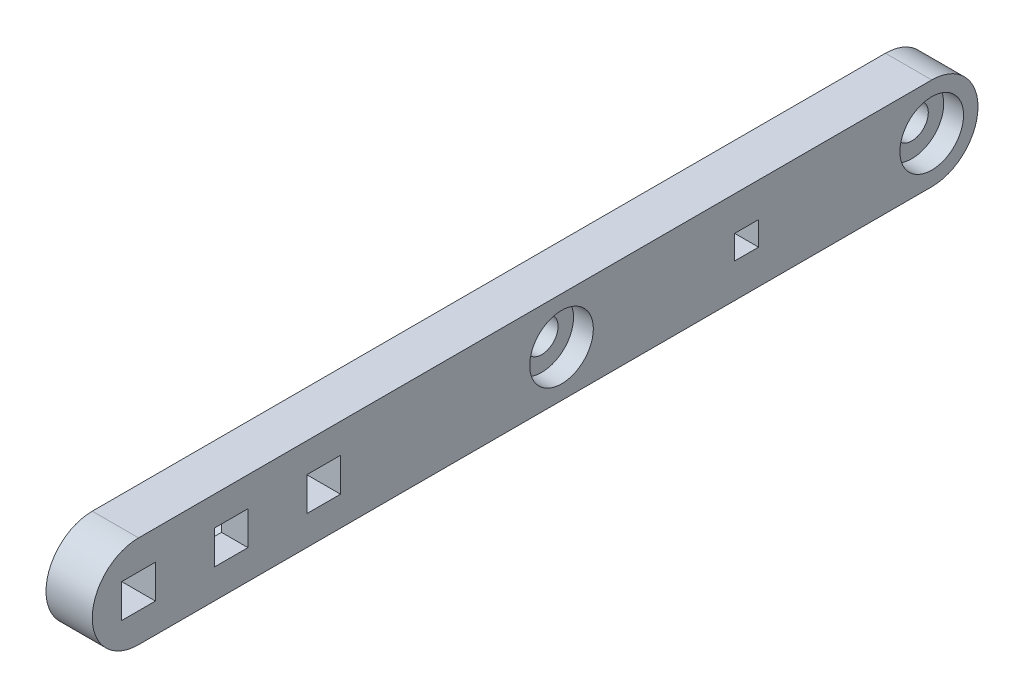
ISO-10303-21;
HEADER;
FILE_DESCRIPTION(('STEP AP214'),'2;1');
FILE_NAME('part.step','',(''),(''),'','','');
FILE_SCHEMA(('AUTOMOTIVE_DESIGN { 1 0 10303 214 1 1 1 1 }'));
ENDSEC;
DATA;
#1=APPLICATION_CONTEXT('core data for automotive mechanical design processes');
#2=APPLICATION_PROTOCOL_DEFINITION('international standard','automotive_design',2000,#1);
#3=PRODUCT_CONTEXT('',#1,'mechanical');
#4=PRODUCT('Part','Part','',(#3));
#5=PRODUCT_RELATED_PRODUCT_CATEGORY('part','',(#4));
#6=PRODUCT_DEFINITION_FORMATION('','',#4);
#7=PRODUCT_DEFINITION_CONTEXT('part definition',#1,'design');
#8=PRODUCT_DEFINITION('design','',#6,#7);
#9=PRODUCT_DEFINITION_SHAPE('','',#8);
#10=(LENGTH_UNIT() NAMED_UNIT(*) SI_UNIT(.MILLI.,.METRE.));
#11=(NAMED_UNIT(*) PLANE_ANGLE_UNIT() SI_UNIT($,.RADIAN.));
#12=(NAMED_UNIT(*) SI_UNIT($,.STERADIAN.) SOLID_ANGLE_UNIT());
#13=UNCERTAINTY_MEASURE_WITH_UNIT(LENGTH_MEASURE(1.E-05),#10,'distance_accuracy_value','');
#14=(GEOMETRIC_REPRESENTATION_CONTEXT(3) GLOBAL_UNCERTAINTY_ASSIGNED_CONTEXT((#13)) GLOBAL_UNIT_ASSIGNED_CONTEXT((#10,
#11,#12)) REPRESENTATION_CONTEXT('',''));
#15=CARTESIAN_POINT('',(0.,0.,0.));
#16=DIRECTION('',(0.,0.,1.));
#17=DIRECTION('',(1.,0.,0.));
#18=AXIS2_PLACEMENT_3D('',#15,#16,#17);
#19=CARTESIAN_POINT('',(0.,0.,0.));
#20=DIRECTION('',(1.,0.,0.));
#21=DIRECTION('',(0.,0.,-1.));
#22=AXIS2_PLACEMENT_3D('',#19,#20,#21);
#23=PLANE('',#22);
#24=DIRECTION('',(0.,-1.,0.));
#25=VECTOR('',#24,1.);
#26=CARTESIAN_POINT('',(0.,0.,-1.6375));
#27=LINE('',#26,#25);
#28=CARTESIAN_POINT('',(0.,1.6375,-1.6375));
#29=VERTEX_POINT('',#28);
#30=CARTESIAN_POINT('',(0.,-1.6375,-1.6375));
#31=VERTEX_POINT('',#30);
#32=EDGE_CURVE('E391',#29,#31,#27,.T.);
#33=ORIENTED_EDGE('',*,*,#32,.F.);
#34=DIRECTION('',(0.,0.,-1.));
#35=VECTOR('',#34,1.);
#36=CARTESIAN_POINT('',(0.,1.6375,0.));
#37=LINE('',#36,#35);
#38=CARTESIAN_POINT('',(0.,1.6375,1.6375));
#39=VERTEX_POINT('',#38);
#40=EDGE_CURVE('E400',#39,#29,#37,.T.);
#41=ORIENTED_EDGE('',*,*,#40,.F.);
#42=DIRECTION('',(0.,-1.,0.));
#43=VECTOR('',#42,1.);
#44=CARTESIAN_POINT('',(0.,0.,1.6375));
#45=LINE('',#44,#43);
#46=CARTESIAN_POINT('',(0.,-1.6375,1.6375));
#47=VERTEX_POINT('',#46);
#48=EDGE_CURVE('E397',#39,#47,#45,.T.);
#49=ORIENTED_EDGE('',*,*,#48,.T.);
#50=DIRECTION('',(0.,0.,-1.));
#51=VECTOR('',#50,1.);
#52=CARTESIAN_POINT('',(0.,-1.6375,0.));
#53=LINE('',#52,#51);
#54=EDGE_CURVE('E394',#47,#31,#53,.T.);
#55=ORIENTED_EDGE('',*,*,#54,.T.);
#56=EDGE_LOOP('',(#33,#41,#49,#55));
#57=FACE_BOUND('',#56,.T.);
#58=DIRECTION('',(0.,-1.,0.));
#59=VECTOR('',#58,1.);
#60=CARTESIAN_POINT('',(0.,0.,60.3504));
#61=LINE('',#60,#59);
#62=CARTESIAN_POINT('',(0.,2.3114,60.3504));
#63=VERTEX_POINT('',#62);
#64=CARTESIAN_POINT('',(0.,-2.31139999999999,60.3504));
#65=VERTEX_POINT('',#64);
#66=EDGE_CURVE('E402',#63,#65,#61,.T.);
#67=ORIENTED_EDGE('',*,*,#66,.T.);
#68=DIRECTION('',(0.,0.,-1.));
#69=VECTOR('',#68,1.);
#70=CARTESIAN_POINT('',(0.,-2.31139999999999,0.));
#71=LINE('',#70,#69);
#72=CARTESIAN_POINT('',(0.,-2.31139999999999,55.7276));
#73=VERTEX_POINT('',#72);
#74=EDGE_CURVE('E334',#65,#73,#71,.T.);
#75=ORIENTED_EDGE('',*,*,#74,.T.);
#76=DIRECTION('',(0.,-1.,0.));
#77=VECTOR('',#76,1.);
#78=CARTESIAN_POINT('',(0.,0.,55.7276));
#79=LINE('',#78,#77);
#80=CARTESIAN_POINT('',(0.,2.3114,55.7276));
#81=VERTEX_POINT('',#80);
#82=EDGE_CURVE('E407',#81,#73,#79,.T.);
#83=ORIENTED_EDGE('',*,*,#82,.F.);
#84=DIRECTION('',(0.,0.,-1.));
#85=VECTOR('',#84,1.);
#86=CARTESIAN_POINT('',(0.,2.3114,0.));
#87=LINE('',#86,#85);
#88=EDGE_CURVE('E404',#63,#81,#87,.T.);
#89=ORIENTED_EDGE('',*,*,#88,.F.);
#90=EDGE_LOOP('',(#67,#75,#83,#89));
#91=FACE_BOUND('',#90,.T.);
#92=DIRECTION('',(0.,0.,-1.));
#93=VECTOR('',#92,1.);
#94=CARTESIAN_POINT('',(0.,-2.31139999999999,0.));
#95=LINE('',#94,#93);
#96=CARTESIAN_POINT('',(0.,-2.31139999999999,85.7504));
#97=VERTEX_POINT('',#96);
#98=CARTESIAN_POINT('',(0.,-2.31139999999999,81.1276));
#99=VERTEX_POINT('',#98);
#100=EDGE_CURVE('E379',#97,#99,#95,.T.);
#101=ORIENTED_EDGE('',*,*,#100,.T.);
#102=DIRECTION('',(0.,-1.,0.));
#103=VECTOR('',#102,1.);
#104=CARTESIAN_POINT('',(0.,0.,81.1276));
#105=LINE('',#104,#103);
#106=CARTESIAN_POINT('',(0.,2.3114,81.1276));
#107=VERTEX_POINT('',#106);
#108=EDGE_CURVE('E388',#107,#99,#105,.T.);
#109=ORIENTED_EDGE('',*,*,#108,.F.);
#110=DIRECTION('',(0.,0.,-1.));
#111=VECTOR('',#110,1.);
#112=CARTESIAN_POINT('',(0.,2.3114,0.));
#113=LINE('',#112,#111);
#114=CARTESIAN_POINT('',(0.,2.3114,85.7504));
#115=VERTEX_POINT('',#114);
#116=EDGE_CURVE('E385',#115,#107,#113,.T.);
#117=ORIENTED_EDGE('',*,*,#116,.F.);
#118=DIRECTION('',(0.,-1.,0.));
#119=VECTOR('',#118,1.);
#120=CARTESIAN_POINT('',(0.,0.,85.7504));
#121=LINE('',#120,#119);
#122=EDGE_CURVE('E382',#115,#97,#121,.T.);
#123=ORIENTED_EDGE('',*,*,#122,.T.);
#124=EDGE_LOOP('',(#101,#109,#117,#123));
#125=FACE_BOUND('',#124,.T.);
#126=CARTESIAN_POINT('',(0.,0.,83.439));
#127=DIRECTION('',(1.,0.,0.));
#128=DIRECTION('',(0.,0.,-1.));
#129=AXIS2_PLACEMENT_3D('',#126,#127,#128);
#130=CIRCLE('',#129,6.35);
#131=CARTESIAN_POINT('',(0.,6.35000000000002,83.439));
#132=VERTEX_POINT('',#131);
#133=CARTESIAN_POINT('',(0.,-6.35000000000001,83.439));
#134=VERTEX_POINT('',#133);
#135=EDGE_CURVE('E312',#132,#134,#130,.T.);
#136=ORIENTED_EDGE('',*,*,#135,.F.);
#137=DIRECTION('',(0.,0.,-1.));
#138=VECTOR('',#137,1.);
#139=CARTESIAN_POINT('',(0.,6.35,0.));
#140=LINE('',#139,#138);
#141=CARTESIAN_POINT('',(0.,6.35000000000001,-25.4));
#142=VERTEX_POINT('',#141);
#143=EDGE_CURVE('E377',#132,#142,#140,.T.);
#144=ORIENTED_EDGE('',*,*,#143,.T.);
#145=CARTESIAN_POINT('',(0.,0.,-25.4));
#146=DIRECTION('',(1.,0.,0.));
#147=DIRECTION('',(0.,0.,-1.));
#148=AXIS2_PLACEMENT_3D('',#145,#146,#147);
#149=CIRCLE('',#148,6.35);
#150=CARTESIAN_POINT('',(0.,-6.35000000000001,-25.4));
#151=VERTEX_POINT('',#150);
#152=EDGE_CURVE('E313',#151,#142,#149,.T.);
#153=ORIENTED_EDGE('',*,*,#152,.F.);
#154=DIRECTION('',(0.,0.,-1.));
#155=VECTOR('',#154,1.);
#156=CARTESIAN_POINT('',(0.,-6.35,0.));
#157=LINE('',#156,#155);
#158=EDGE_CURVE('E374',#134,#151,#157,.T.);
#159=ORIENTED_EDGE('',*,*,#158,.F.);
#160=EDGE_LOOP('',(#136,#144,#153,#159));
#161=FACE_BOUND('',#160,.T.);
#162=CARTESIAN_POINT('',(0.,0.,-25.4));
#163=DIRECTION('',(1.,0.,0.));
#164=DIRECTION('',(0.,0.,-1.));
#165=AXIS2_PLACEMENT_3D('',#162,#163,#164);
#166=CIRCLE('',#165,2.2479);
#167=CARTESIAN_POINT('',(0.,0.,-27.6479));
#168=VERTEX_POINT('',#167);
#169=EDGE_CURVE('E316',#168,#168,#166,.T.);
#170=ORIENTED_EDGE('',*,*,#169,.T.);
#171=EDGE_LOOP('',(#170));
#172=FACE_BOUND('',#171,.T.);
#173=CARTESIAN_POINT('',(0.,0.,25.4));
#174=DIRECTION('',(1.,0.,0.));
#175=DIRECTION('',(0.,0.,-1.));
#176=AXIS2_PLACEMENT_3D('',#173,#174,#175);
#177=CIRCLE('',#176,2.2479);
#178=CARTESIAN_POINT('',(0.,0.,23.1521));
#179=VERTEX_POINT('',#178);
#180=EDGE_CURVE('E436',#179,#179,#177,.T.);
#181=ORIENTED_EDGE('',*,*,#180,.T.);
#182=EDGE_LOOP('',(#181));
#183=FACE_BOUND('',#182,.T.);
#184=CARTESIAN_POINT('',(0.,0.,70.739));
#185=DIRECTION('',(-1.,0.,0.));
#186=DIRECTION('',(0.,0.,1.));
#187=AXIS2_PLACEMENT_3D('',#184,#185,#186);
#188=CIRCLE('',#187,4.36626);
#189=CARTESIAN_POINT('',(0.,0.,75.10526));
#190=VERTEX_POINT('',#189);
#191=EDGE_CURVE('E427',#190,#190,#188,.T.);
#192=ORIENTED_EDGE('',*,*,#191,.F.);
#193=EDGE_LOOP('',(#192));
#194=FACE_BOUND('',#193,.T.);
#195=ADVANCED_FACE('F104',(#57,#91,#125,#161,#172,#183,#194),#23,.F.);
#196=CARTESIAN_POINT('',(6.35,0.,85.7504));
#197=DIRECTION('',(0.,0.,-1.));
#198=DIRECTION('',(-1.,0.,0.));
#199=AXIS2_PLACEMENT_3D('',#196,#197,#198);
#200=PLANE('',#199);
#201=ORIENTED_EDGE('',*,*,#122,.F.);
#202=DIRECTION('',(-1.,0.,0.));
#203=VECTOR('',#202,1.);
#204=CARTESIAN_POINT('',(6.35,2.3114,85.7504));
#205=LINE('',#204,#203);
#206=CARTESIAN_POINT('',(6.35,2.3114,85.7504));
#207=VERTEX_POINT('',#206);
#208=EDGE_CURVE('E299',#207,#115,#205,.T.);
#209=ORIENTED_EDGE('',*,*,#208,.F.);
#210=DIRECTION('',(0.,-1.,0.));
#211=VECTOR('',#210,1.);
#212=CARTESIAN_POINT('',(6.35,0.,85.7504));
#213=LINE('',#212,#211);
#214=CARTESIAN_POINT('',(6.35,-2.31139999999999,85.7504));
#215=VERTEX_POINT('',#214);
#216=EDGE_CURVE('E343',#207,#215,#213,.T.);
#217=ORIENTED_EDGE('',*,*,#216,.T.);
#218=DIRECTION('',(-1.,0.,0.));
#219=VECTOR('',#218,1.);
#220=CARTESIAN_POINT('',(6.35,-2.31139999999999,85.7504));
#221=LINE('',#220,#219);
#222=EDGE_CURVE('E289',#215,#97,#221,.T.);
#223=ORIENTED_EDGE('',*,*,#222,.T.);
#224=EDGE_LOOP('',(#201,#209,#217,#223));
#225=FACE_BOUND('',#224,.T.);
#226=ADVANCED_FACE('F468',(#225),#200,.T.);
#227=CARTESIAN_POINT('',(6.35,2.3114,0.));
#228=DIRECTION('',(0.,1.,0.));
#229=DIRECTION('',(0.,0.,1.));
#230=AXIS2_PLACEMENT_3D('',#227,#228,#229);
#231=PLANE('',#230);
#232=ORIENTED_EDGE('',*,*,#116,.T.);
#233=DIRECTION('',(-1.,0.,0.));
#234=VECTOR('',#233,1.);
#235=CARTESIAN_POINT('',(6.35,2.3114,81.1276));
#236=LINE('',#235,#234);
#237=CARTESIAN_POINT('',(6.35,2.3114,81.1276));
#238=VERTEX_POINT('',#237);
#239=EDGE_CURVE('E296',#238,#107,#236,.T.);
#240=ORIENTED_EDGE('',*,*,#239,.F.);
#241=DIRECTION('',(0.,0.,-1.));
#242=VECTOR('',#241,1.);
#243=CARTESIAN_POINT('',(6.35,2.3114,0.));
#244=LINE('',#243,#242);
#245=EDGE_CURVE('E346',#207,#238,#244,.T.);
#246=ORIENTED_EDGE('',*,*,#245,.F.);
#247=ORIENTED_EDGE('',*,*,#208,.T.);
#248=EDGE_LOOP('',(#232,#240,#246,#247));
#249=FACE_BOUND('',#248,.T.);
#250=ADVANCED_FACE('F474',(#249),#231,.F.);
#251=CARTESIAN_POINT('',(6.35,0.,81.1276));
#252=DIRECTION('',(0.,0.,-1.));
#253=DIRECTION('',(-1.,0.,0.));
#254=AXIS2_PLACEMENT_3D('',#251,#252,#253);
#255=PLANE('',#254);
#256=ORIENTED_EDGE('',*,*,#108,.T.);
#257=DIRECTION('',(-1.,0.,0.));
#258=VECTOR('',#257,1.);
#259=CARTESIAN_POINT('',(6.35,-2.31139999999999,81.1276));
#260=LINE('',#259,#258);
#261=CARTESIAN_POINT('',(6.35,-2.31139999999999,81.1276));
#262=VERTEX_POINT('',#261);
#263=EDGE_CURVE('E294',#262,#99,#260,.T.);
#264=ORIENTED_EDGE('',*,*,#263,.F.);
#265=DIRECTION('',(0.,-1.,0.));
#266=VECTOR('',#265,1.);
#267=CARTESIAN_POINT('',(6.35,0.,81.1276));
#268=LINE('',#267,#266);
#269=EDGE_CURVE('E349',#238,#262,#268,.T.);
#270=ORIENTED_EDGE('',*,*,#269,.F.);
#271=ORIENTED_EDGE('',*,*,#239,.T.);
#272=EDGE_LOOP('',(#256,#264,#270,#271));
#273=FACE_BOUND('',#272,.T.);
#274=ADVANCED_FACE('F476',(#273),#255,.F.);
#275=CARTESIAN_POINT('',(6.35,-2.31139999999999,0.));
#276=DIRECTION('',(0.,1.,0.));
#277=DIRECTION('',(0.,0.,1.));
#278=AXIS2_PLACEMENT_3D('',#275,#276,#277);
#279=PLANE('',#278);
#280=ORIENTED_EDGE('',*,*,#100,.F.);
#281=ORIENTED_EDGE('',*,*,#222,.F.);
#282=DIRECTION('',(0.,0.,-1.));
#283=VECTOR('',#282,1.);
#284=CARTESIAN_POINT('',(6.35,-2.31139999999999,0.));
#285=LINE('',#284,#283);
#286=EDGE_CURVE('E340',#215,#262,#285,.T.);
#287=ORIENTED_EDGE('',*,*,#286,.T.);
#288=ORIENTED_EDGE('',*,*,#263,.T.);
#289=EDGE_LOOP('',(#280,#281,#287,#288));
#290=FACE_BOUND('',#289,.T.);
#291=ADVANCED_FACE('F477',(#290),#279,.T.);
#292=CARTESIAN_POINT('',(6.35,0.,83.439));
#293=DIRECTION('',(-1.,0.,0.));
#294=DIRECTION('',(0.,0.,1.));
#295=AXIS2_PLACEMENT_3D('',#292,#293,#294);
#296=CYLINDRICAL_SURFACE('',#295,6.35);
#297=ORIENTED_EDGE('',*,*,#135,.T.);
#298=DIRECTION('',(-1.,0.,0.));
#299=VECTOR('',#298,1.);
#300=CARTESIAN_POINT('',(6.35,-6.35000000000001,83.439));
#301=LINE('',#300,#299);
#302=CARTESIAN_POINT('',(6.35,-6.35000000000001,83.439));
#303=VERTEX_POINT('',#302);
#304=EDGE_CURVE('E193',#303,#134,#301,.T.);
#305=ORIENTED_EDGE('',*,*,#304,.F.);
#306=CARTESIAN_POINT('',(6.35,0.,83.439));
#307=DIRECTION('',(1.,0.,0.));
#308=DIRECTION('',(0.,0.,-1.));
#309=AXIS2_PLACEMENT_3D('',#306,#307,#308);
#310=CIRCLE('',#309,6.35);
#311=CARTESIAN_POINT('',(6.35,6.35000000000002,83.439));
#312=VERTEX_POINT('',#311);
#313=EDGE_CURVE('E330',#312,#303,#310,.T.);
#314=ORIENTED_EDGE('',*,*,#313,.F.);
#315=DIRECTION('',(-1.,0.,0.));
#316=VECTOR('',#315,1.);
#317=CARTESIAN_POINT('',(6.35,6.35000000000002,83.439));
#318=LINE('',#317,#316);
#319=EDGE_CURVE('E302',#312,#132,#318,.T.);
#320=ORIENTED_EDGE('',*,*,#319,.T.);
#321=EDGE_LOOP('',(#297,#305,#314,#320));
#322=FACE_BOUND('',#321,.T.);
#323=ADVANCED_FACE('F456',(#322),#296,.T.);
#324=CARTESIAN_POINT('',(6.35,0.,0.));
#325=DIRECTION('',(1.,0.,0.));
#326=DIRECTION('',(0.,0.,-1.));
#327=AXIS2_PLACEMENT_3D('',#324,#325,#326);
#328=PLANE('',#327);
#329=CARTESIAN_POINT('',(6.35,0.,25.4));
#330=DIRECTION('',(1.,0.,0.));
#331=DIRECTION('',(0.,0.,-1.));
#332=AXIS2_PLACEMENT_3D('',#329,#330,#331);
#333=CIRCLE('',#332,4.36626);
#334=CARTESIAN_POINT('',(6.35,0.,21.03374));
#335=VERTEX_POINT('',#334);
#336=EDGE_CURVE('E420',#335,#335,#333,.T.);
#337=ORIENTED_EDGE('',*,*,#336,.F.);
#338=EDGE_LOOP('',(#337));
#339=FACE_BOUND('',#338,.T.);
#340=CARTESIAN_POINT('',(6.35,0.,-25.4));
#341=DIRECTION('',(1.,0.,0.));
#342=DIRECTION('',(0.,0.,-1.));
#343=AXIS2_PLACEMENT_3D('',#340,#341,#342);
#344=CIRCLE('',#343,4.36626);
#345=CARTESIAN_POINT('',(6.35,0.,-29.76626));
#346=VERTEX_POINT('',#345);
#347=EDGE_CURVE('E439',#346,#346,#344,.T.);
#348=ORIENTED_EDGE('',*,*,#347,.F.);
#349=EDGE_LOOP('',(#348));
#350=FACE_BOUND('',#349,.T.);
#351=ORIENTED_EDGE('',*,*,#313,.T.);
#352=DIRECTION('',(0.,0.,-1.));
#353=VECTOR('',#352,1.);
#354=CARTESIAN_POINT('',(6.35,-6.35,0.));
#355=LINE('',#354,#353);
#356=CARTESIAN_POINT('',(6.35,-6.35000000000001,-25.4));
#357=VERTEX_POINT('',#356);
#358=EDGE_CURVE('E333',#303,#357,#355,.T.);
#359=ORIENTED_EDGE('',*,*,#358,.T.);
#360=CARTESIAN_POINT('',(6.35,0.,-25.4));
#361=DIRECTION('',(1.,0.,0.));
#362=DIRECTION('',(0.,0.,-1.));
#363=AXIS2_PLACEMENT_3D('',#360,#361,#362);
#364=CIRCLE('',#363,6.35);
#365=CARTESIAN_POINT('',(6.35,6.35000000000001,-25.4));
#366=VERTEX_POINT('',#365);
#367=EDGE_CURVE('E309',#357,#366,#364,.T.);
#368=ORIENTED_EDGE('',*,*,#367,.T.);
#369=DIRECTION('',(0.,0.,-1.));
#370=VECTOR('',#369,1.);
#371=CARTESIAN_POINT('',(6.35,6.35,0.));
#372=LINE('',#371,#370);
#373=EDGE_CURVE('E337',#312,#366,#372,.T.);
#374=ORIENTED_EDGE('',*,*,#373,.F.);
#375=EDGE_LOOP('',(#351,#359,#368,#374));
#376=FACE_BOUND('',#375,.T.);
#377=ORIENTED_EDGE('',*,*,#286,.F.);
#378=ORIENTED_EDGE('',*,*,#216,.F.);
#379=ORIENTED_EDGE('',*,*,#245,.T.);
#380=ORIENTED_EDGE('',*,*,#269,.T.);
#381=EDGE_LOOP('',(#377,#378,#379,#380));
#382=FACE_BOUND('',#381,.T.);
#383=DIRECTION('',(0.,-1.,0.));
#384=VECTOR('',#383,1.);
#385=CARTESIAN_POINT('',(6.35,0.,73.0504));
#386=LINE('',#385,#384);
#387=CARTESIAN_POINT('',(6.35,2.3114,73.0504));
#388=VERTEX_POINT('',#387);
#389=CARTESIAN_POINT('',(6.35,-2.31139999999999,73.0504));
#390=VERTEX_POINT('',#389);
#391=EDGE_CURVE('E264',#388,#390,#386,.T.);
#392=ORIENTED_EDGE('',*,*,#391,.F.);
#393=DIRECTION('',(0.,0.,-1.));
#394=VECTOR('',#393,1.);
#395=CARTESIAN_POINT('',(6.35,2.3114,0.));
#396=LINE('',#395,#394);
#397=CARTESIAN_POINT('',(6.35,2.3114,68.4276));
#398=VERTEX_POINT('',#397);
#399=EDGE_CURVE('E258',#388,#398,#396,.T.);
#400=ORIENTED_EDGE('',*,*,#399,.T.);
#401=DIRECTION('',(0.,-1.,0.));
#402=VECTOR('',#401,1.);
#403=CARTESIAN_POINT('',(6.35,0.,68.4276));
#404=LINE('',#403,#402);
#405=CARTESIAN_POINT('',(6.35,-2.31139999999999,68.4276));
#406=VERTEX_POINT('',#405);
#407=EDGE_CURVE('E247',#398,#406,#404,.T.);
#408=ORIENTED_EDGE('',*,*,#407,.T.);
#409=DIRECTION('',(0.,0.,-1.));
#410=VECTOR('',#409,1.);
#411=CARTESIAN_POINT('',(6.35,-2.31139999999999,0.));
#412=LINE('',#411,#410);
#413=EDGE_CURVE('E257',#390,#406,#412,.T.);
#414=ORIENTED_EDGE('',*,*,#413,.F.);
#415=EDGE_LOOP('',(#392,#400,#408,#414));
#416=FACE_BOUND('',#415,.T.);
#417=DIRECTION('',(0.,-1.,0.));
#418=VECTOR('',#417,1.);
#419=CARTESIAN_POINT('',(6.35,0.,60.3504));
#420=LINE('',#419,#418);
#421=CARTESIAN_POINT('',(6.35,2.3114,60.3504));
#422=VERTEX_POINT('',#421);
#423=CARTESIAN_POINT('',(6.35,-2.31139999999999,60.3504));
#424=VERTEX_POINT('',#423);
#425=EDGE_CURVE('E361',#422,#424,#420,.T.);
#426=ORIENTED_EDGE('',*,*,#425,.F.);
#427=DIRECTION('',(0.,0.,-1.));
#428=VECTOR('',#427,1.);
#429=CARTESIAN_POINT('',(6.35,2.3114,0.));
#430=LINE('',#429,#428);
#431=CARTESIAN_POINT('',(6.35,2.3114,55.7276));
#432=VERTEX_POINT('',#431);
#433=EDGE_CURVE('E363',#422,#432,#430,.T.);
#434=ORIENTED_EDGE('',*,*,#433,.T.);
#435=DIRECTION('',(0.,-1.,0.));
#436=VECTOR('',#435,1.);
#437=CARTESIAN_POINT('',(6.35,0.,55.7276));
#438=LINE('',#437,#436);
#439=CARTESIAN_POINT('',(6.35,-2.31139999999999,55.7276));
#440=VERTEX_POINT('',#439);
#441=EDGE_CURVE('E366',#432,#440,#438,.T.);
#442=ORIENTED_EDGE('',*,*,#441,.T.);
#443=DIRECTION('',(0.,0.,-1.));
#444=VECTOR('',#443,1.);
#445=CARTESIAN_POINT('',(6.35,-2.31139999999999,0.));
#446=LINE('',#445,#444);
#447=EDGE_CURVE('E368',#424,#440,#446,.T.);
#448=ORIENTED_EDGE('',*,*,#447,.F.);
#449=EDGE_LOOP('',(#426,#434,#442,#448));
#450=FACE_BOUND('',#449,.T.);
#451=DIRECTION('',(0.,-1.,0.));
#452=VECTOR('',#451,1.);
#453=CARTESIAN_POINT('',(6.35,0.,-1.6375));
#454=LINE('',#453,#452);
#455=CARTESIAN_POINT('',(6.35,1.6375,-1.6375));
#456=VERTEX_POINT('',#455);
#457=CARTESIAN_POINT('',(6.35,-1.6375,-1.6375));
#458=VERTEX_POINT('',#457);
#459=EDGE_CURVE('E351',#456,#458,#454,.T.);
#460=ORIENTED_EDGE('',*,*,#459,.T.);
#461=DIRECTION('',(0.,0.,-1.));
#462=VECTOR('',#461,1.);
#463=CARTESIAN_POINT('',(6.35,-1.6375,0.));
#464=LINE('',#463,#462);
#465=CARTESIAN_POINT('',(6.35,-1.6375,1.6375));
#466=VERTEX_POINT('',#465);
#467=EDGE_CURVE('E353',#466,#458,#464,.T.);
#468=ORIENTED_EDGE('',*,*,#467,.F.);
#469=DIRECTION('',(0.,-1.,0.));
#470=VECTOR('',#469,1.);
#471=CARTESIAN_POINT('',(6.35,0.,1.6375));
#472=LINE('',#471,#470);
#473=CARTESIAN_POINT('',(6.35,1.6375,1.6375));
#474=VERTEX_POINT('',#473);
#475=EDGE_CURVE('E356',#474,#466,#472,.T.);
#476=ORIENTED_EDGE('',*,*,#475,.F.);
#477=DIRECTION('',(0.,0.,-1.));
#478=VECTOR('',#477,1.);
#479=CARTESIAN_POINT('',(6.35,1.6375,0.));
#480=LINE('',#479,#478);
#481=EDGE_CURVE('E359',#474,#456,#480,.T.);
#482=ORIENTED_EDGE('',*,*,#481,.T.);
#483=EDGE_LOOP('',(#460,#468,#476,#482));
#484=FACE_BOUND('',#483,.T.);
#485=ADVANCED_FACE('F262',(#339,#350,#376,#382,#416,#450,#484),#328,.T.);
#486=CARTESIAN_POINT('',(6.35,-6.35,0.));
#487=DIRECTION('',(0.,1.,0.));
#488=DIRECTION('',(0.,0.,1.));
#489=AXIS2_PLACEMENT_3D('',#486,#487,#488);
#490=PLANE('',#489);
#491=ORIENTED_EDGE('',*,*,#158,.T.);
#492=DIRECTION('',(-1.,0.,0.));
#493=VECTOR('',#492,1.);
#494=CARTESIAN_POINT('',(6.35,-6.35000000000001,-25.4));
#495=LINE('',#494,#493);
#496=EDGE_CURVE('E306',#357,#151,#495,.T.);
#497=ORIENTED_EDGE('',*,*,#496,.F.);
#498=ORIENTED_EDGE('',*,*,#358,.F.);
#499=ORIENTED_EDGE('',*,*,#304,.T.);
#500=EDGE_LOOP('',(#491,#497,#498,#499));
#501=FACE_BOUND('',#500,.T.);
#502=ADVANCED_FACE('F455',(#501),#490,.F.);
#503=CARTESIAN_POINT('',(6.35,6.35,0.));
#504=DIRECTION('',(0.,1.,0.));
#505=DIRECTION('',(0.,0.,1.));
#506=AXIS2_PLACEMENT_3D('',#503,#504,#505);
#507=PLANE('',#506);
#508=ORIENTED_EDGE('',*,*,#143,.F.);
#509=ORIENTED_EDGE('',*,*,#319,.F.);
#510=ORIENTED_EDGE('',*,*,#373,.T.);
#511=DIRECTION('',(-1.,0.,0.));
#512=VECTOR('',#511,1.);
#513=CARTESIAN_POINT('',(6.35,6.35000000000001,-25.4));
#514=LINE('',#513,#512);
#515=EDGE_CURVE('E304',#366,#142,#514,.T.);
#516=ORIENTED_EDGE('',*,*,#515,.T.);
#517=EDGE_LOOP('',(#508,#509,#510,#516));
#518=FACE_BOUND('',#517,.T.);
#519=ADVANCED_FACE('F555',(#518),#507,.T.);
#520=CARTESIAN_POINT('',(6.35,-1.6375,0.));
#521=DIRECTION('',(0.,1.,0.));
#522=DIRECTION('',(0.,0.,1.));
#523=AXIS2_PLACEMENT_3D('',#520,#521,#522);
#524=PLANE('',#523);
#525=ORIENTED_EDGE('',*,*,#54,.F.);
#526=DIRECTION('',(-1.,0.,0.));
#527=VECTOR('',#526,1.);
#528=CARTESIAN_POINT('',(6.35,-1.6375,1.6375));
#529=LINE('',#528,#527);
#530=EDGE_CURVE('E291',#466,#47,#529,.T.);
#531=ORIENTED_EDGE('',*,*,#530,.F.);
#532=ORIENTED_EDGE('',*,*,#467,.T.);
#533=DIRECTION('',(-1.,0.,0.));
#534=VECTOR('',#533,1.);
#535=CARTESIAN_POINT('',(6.35,-1.6375,-1.6375));
#536=LINE('',#535,#534);
#537=EDGE_CURVE('E278',#458,#31,#536,.T.);
#538=ORIENTED_EDGE('',*,*,#537,.T.);
#539=EDGE_LOOP('',(#525,#531,#532,#538));
#540=FACE_BOUND('',#539,.T.);
#541=ADVANCED_FACE('F551',(#540),#524,.T.);
#542=CARTESIAN_POINT('',(6.35,0.,1.6375));
#543=DIRECTION('',(0.,0.,-1.));
#544=DIRECTION('',(0.,1.,0.));
#545=AXIS2_PLACEMENT_3D('',#542,#543,#544);
#546=PLANE('',#545);
#547=ORIENTED_EDGE('',*,*,#48,.F.);
#548=DIRECTION('',(-1.,0.,0.));
#549=VECTOR('',#548,1.);
#550=CARTESIAN_POINT('',(6.35,1.6375,1.6375));
#551=LINE('',#550,#549);
#552=EDGE_CURVE('E288',#474,#39,#551,.T.);
#553=ORIENTED_EDGE('',*,*,#552,.F.);
#554=ORIENTED_EDGE('',*,*,#475,.T.);
#555=ORIENTED_EDGE('',*,*,#530,.T.);
#556=EDGE_LOOP('',(#547,#553,#554,#555));
#557=FACE_BOUND('',#556,.T.);
#558=ADVANCED_FACE('F547',(#557),#546,.T.);
#559=CARTESIAN_POINT('',(6.35,1.6375,0.));
#560=DIRECTION('',(0.,1.,0.));
#561=DIRECTION('',(0.,0.,1.));
#562=AXIS2_PLACEMENT_3D('',#559,#560,#561);
#563=PLANE('',#562);
#564=ORIENTED_EDGE('',*,*,#40,.T.);
#565=DIRECTION('',(-1.,0.,0.));
#566=VECTOR('',#565,1.);
#567=CARTESIAN_POINT('',(6.35,1.6375,-1.6375));
#568=LINE('',#567,#566);
#569=EDGE_CURVE('E285',#456,#29,#568,.T.);
#570=ORIENTED_EDGE('',*,*,#569,.F.);
#571=ORIENTED_EDGE('',*,*,#481,.F.);
#572=ORIENTED_EDGE('',*,*,#552,.T.);
#573=EDGE_LOOP('',(#564,#570,#571,#572));
#574=FACE_BOUND('',#573,.T.);
#575=ADVANCED_FACE('F544',(#574),#563,.F.);
#576=CARTESIAN_POINT('',(6.35,0.,-1.6375));
#577=DIRECTION('',(0.,0.,-1.));
#578=DIRECTION('',(0.,1.,0.));
#579=AXIS2_PLACEMENT_3D('',#576,#577,#578);
#580=PLANE('',#579);
#581=ORIENTED_EDGE('',*,*,#32,.T.);
#582=ORIENTED_EDGE('',*,*,#537,.F.);
#583=ORIENTED_EDGE('',*,*,#459,.F.);
#584=ORIENTED_EDGE('',*,*,#569,.T.);
#585=EDGE_LOOP('',(#581,#582,#583,#584));
#586=FACE_BOUND('',#585,.T.);
#587=ADVANCED_FACE('F540',(#586),#580,.F.);
#588=CARTESIAN_POINT('',(6.35,2.3114,0.));
#589=DIRECTION('',(0.,1.,0.));
#590=DIRECTION('',(0.,0.,1.));
#591=AXIS2_PLACEMENT_3D('',#588,#589,#590);
#592=PLANE('',#591);
#593=ORIENTED_EDGE('',*,*,#88,.T.);
#594=DIRECTION('',(-1.,0.,0.));
#595=VECTOR('',#594,1.);
#596=CARTESIAN_POINT('',(6.35,2.3114,55.7276));
#597=LINE('',#596,#595);
#598=EDGE_CURVE('E280',#432,#81,#597,.T.);
#599=ORIENTED_EDGE('',*,*,#598,.F.);
#600=ORIENTED_EDGE('',*,*,#433,.F.);
#601=DIRECTION('',(-1.,0.,0.));
#602=VECTOR('',#601,1.);
#603=CARTESIAN_POINT('',(6.35,2.3114,60.3504));
#604=LINE('',#603,#602);
#605=EDGE_CURVE('E283',#422,#63,#604,.T.);
#606=ORIENTED_EDGE('',*,*,#605,.T.);
#607=EDGE_LOOP('',(#593,#599,#600,#606));
#608=FACE_BOUND('',#607,.T.);
#609=ADVANCED_FACE('F536',(#608),#592,.F.);
#610=CARTESIAN_POINT('',(6.35,0.,55.7276));
#611=DIRECTION('',(0.,0.,-1.));
#612=DIRECTION('',(-1.,0.,0.));
#613=AXIS2_PLACEMENT_3D('',#610,#611,#612);
#614=PLANE('',#613);
#615=ORIENTED_EDGE('',*,*,#82,.T.);
#616=DIRECTION('',(-1.,0.,0.));
#617=VECTOR('',#616,1.);
#618=CARTESIAN_POINT('',(6.35,-2.31139999999999,55.7276));
#619=LINE('',#618,#617);
#620=EDGE_CURVE('E277',#440,#73,#619,.T.);
#621=ORIENTED_EDGE('',*,*,#620,.F.);
#622=ORIENTED_EDGE('',*,*,#441,.F.);
#623=ORIENTED_EDGE('',*,*,#598,.T.);
#624=EDGE_LOOP('',(#615,#621,#622,#623));
#625=FACE_BOUND('',#624,.T.);
#626=ADVANCED_FACE('F532',(#625),#614,.F.);
#627=CARTESIAN_POINT('',(6.35,-2.31139999999999,0.));
#628=DIRECTION('',(0.,1.,0.));
#629=DIRECTION('',(0.,0.,1.));
#630=AXIS2_PLACEMENT_3D('',#627,#628,#629);
#631=PLANE('',#630);
#632=ORIENTED_EDGE('',*,*,#74,.F.);
#633=DIRECTION('',(-1.,0.,0.));
#634=VECTOR('',#633,1.);
#635=CARTESIAN_POINT('',(6.35,-2.31139999999999,60.3504));
#636=LINE('',#635,#634);
#637=EDGE_CURVE('E185',#424,#65,#636,.T.);
#638=ORIENTED_EDGE('',*,*,#637,.F.);
#639=ORIENTED_EDGE('',*,*,#447,.T.);
#640=ORIENTED_EDGE('',*,*,#620,.T.);
#641=EDGE_LOOP('',(#632,#638,#639,#640));
#642=FACE_BOUND('',#641,.T.);
#643=ADVANCED_FACE('F529',(#642),#631,.T.);
#644=CARTESIAN_POINT('',(6.35,0.,60.3504));
#645=DIRECTION('',(0.,0.,-1.));
#646=DIRECTION('',(-1.,0.,0.));
#647=AXIS2_PLACEMENT_3D('',#644,#645,#646);
#648=PLANE('',#647);
#649=ORIENTED_EDGE('',*,*,#66,.F.);
#650=ORIENTED_EDGE('',*,*,#605,.F.);
#651=ORIENTED_EDGE('',*,*,#425,.T.);
#652=ORIENTED_EDGE('',*,*,#637,.T.);
#653=EDGE_LOOP('',(#649,#650,#651,#652));
#654=FACE_BOUND('',#653,.T.);
#655=ADVANCED_FACE('F526',(#654),#648,.T.);
#656=CARTESIAN_POINT('',(6.35,2.3114,0.));
#657=DIRECTION('',(0.,1.,0.));
#658=DIRECTION('',(0.,0.,1.));
#659=AXIS2_PLACEMENT_3D('',#656,#657,#658);
#660=PLANE('',#659);
#661=DIRECTION('',(-1.,0.,0.));
#662=VECTOR('',#661,1.);
#663=CARTESIAN_POINT('',(6.35,2.3114,73.0504));
#664=LINE('',#663,#662);
#665=CARTESIAN_POINT('',(2.7178,2.3114,73.0504));
#666=VERTEX_POINT('',#665);
#667=EDGE_CURVE('E270',#388,#666,#664,.T.);
#668=ORIENTED_EDGE('',*,*,#667,.T.);
#669=DIRECTION('',(0.,0.,-1.));
#670=VECTOR('',#669,1.);
#671=CARTESIAN_POINT('',(2.7178,2.3114,0.));
#672=LINE('',#671,#670);
#673=CARTESIAN_POINT('',(2.7178,2.3114,68.4276));
#674=VERTEX_POINT('',#673);
#675=EDGE_CURVE('E112',#666,#674,#672,.T.);
#676=ORIENTED_EDGE('',*,*,#675,.T.);
#677=DIRECTION('',(-1.,0.,0.));
#678=VECTOR('',#677,1.);
#679=CARTESIAN_POINT('',(6.35,2.3114,68.4276));
#680=LINE('',#679,#678);
#681=EDGE_CURVE('E252',#398,#674,#680,.T.);
#682=ORIENTED_EDGE('',*,*,#681,.F.);
#683=ORIENTED_EDGE('',*,*,#399,.F.);
#684=EDGE_LOOP('',(#668,#676,#682,#683));
#685=FACE_BOUND('',#684,.T.);
#686=ADVANCED_FACE('F269',(#685),#660,.F.);
#687=CARTESIAN_POINT('',(6.35,0.,68.4276));
#688=DIRECTION('',(0.,0.,-1.));
#689=DIRECTION('',(-1.,0.,0.));
#690=AXIS2_PLACEMENT_3D('',#687,#688,#689);
#691=PLANE('',#690);
#692=ORIENTED_EDGE('',*,*,#681,.T.);
#693=DIRECTION('',(0.,-1.,0.));
#694=VECTOR('',#693,1.);
#695=CARTESIAN_POINT('',(2.7178,0.,68.4276));
#696=LINE('',#695,#694);
#697=CARTESIAN_POINT('',(2.7178,-2.31139999999999,68.4276));
#698=VERTEX_POINT('',#697);
#699=EDGE_CURVE('E418',#674,#698,#696,.T.);
#700=ORIENTED_EDGE('',*,*,#699,.T.);
#701=DIRECTION('',(-1.,0.,0.));
#702=VECTOR('',#701,1.);
#703=CARTESIAN_POINT('',(6.35,-2.31139999999999,68.4276));
#704=LINE('',#703,#702);
#705=EDGE_CURVE('E254',#406,#698,#704,.T.);
#706=ORIENTED_EDGE('',*,*,#705,.F.);
#707=ORIENTED_EDGE('',*,*,#407,.F.);
#708=EDGE_LOOP('',(#692,#700,#706,#707));
#709=FACE_BOUND('',#708,.T.);
#710=ADVANCED_FACE('F249',(#709),#691,.F.);
#711=CARTESIAN_POINT('',(6.35,-2.31139999999999,0.));
#712=DIRECTION('',(0.,1.,0.));
#713=DIRECTION('',(0.,0.,1.));
#714=AXIS2_PLACEMENT_3D('',#711,#712,#713);
#715=PLANE('',#714);
#716=DIRECTION('',(0.,0.,-1.));
#717=VECTOR('',#716,1.);
#718=CARTESIAN_POINT('',(2.7178,-2.31139999999999,0.));
#719=LINE('',#718,#717);
#720=CARTESIAN_POINT('',(2.7178,-2.31139999999999,73.0504));
#721=VERTEX_POINT('',#720);
#722=EDGE_CURVE('E12',#721,#698,#719,.T.);
#723=ORIENTED_EDGE('',*,*,#722,.F.);
#724=DIRECTION('',(-1.,0.,0.));
#725=VECTOR('',#724,1.);
#726=CARTESIAN_POINT('',(6.35,-2.31139999999999,73.0504));
#727=LINE('',#726,#725);
#728=EDGE_CURVE('E126',#390,#721,#727,.T.);
#729=ORIENTED_EDGE('',*,*,#728,.F.);
#730=ORIENTED_EDGE('',*,*,#413,.T.);
#731=ORIENTED_EDGE('',*,*,#705,.T.);
#732=EDGE_LOOP('',(#723,#729,#730,#731));
#733=FACE_BOUND('',#732,.T.);
#734=ADVANCED_FACE('F414',(#733),#715,.T.);
#735=CARTESIAN_POINT('',(6.35,0.,73.0504));
#736=DIRECTION('',(0.,0.,-1.));
#737=DIRECTION('',(-1.,0.,0.));
#738=AXIS2_PLACEMENT_3D('',#735,#736,#737);
#739=PLANE('',#738);
#740=DIRECTION('',(0.,-1.,0.));
#741=VECTOR('',#740,1.);
#742=CARTESIAN_POINT('',(2.7178,0.,73.0504));
#743=LINE('',#742,#741);
#744=EDGE_CURVE('E118',#666,#721,#743,.T.);
#745=ORIENTED_EDGE('',*,*,#744,.F.);
#746=ORIENTED_EDGE('',*,*,#667,.F.);
#747=ORIENTED_EDGE('',*,*,#391,.T.);
#748=ORIENTED_EDGE('',*,*,#728,.T.);
#749=EDGE_LOOP('',(#745,#746,#747,#748));
#750=FACE_BOUND('',#749,.T.);
#751=ADVANCED_FACE('F412',(#750),#739,.T.);
#752=CARTESIAN_POINT('',(6.35,0.,-25.4));
#753=DIRECTION('',(-1.,0.,0.));
#754=DIRECTION('',(0.,0.,1.));
#755=AXIS2_PLACEMENT_3D('',#752,#753,#754);
#756=CYLINDRICAL_SURFACE('',#755,6.35);
#757=ORIENTED_EDGE('',*,*,#367,.F.);
#758=ORIENTED_EDGE('',*,*,#496,.T.);
#759=ORIENTED_EDGE('',*,*,#152,.T.);
#760=ORIENTED_EDGE('',*,*,#515,.F.);
#761=EDGE_LOOP('',(#757,#758,#759,#760));
#762=FACE_BOUND('',#761,.T.);
#763=ADVANCED_FACE('F106',(#762),#756,.T.);
#764=CARTESIAN_POINT('',(6.35,0.,-25.4));
#765=DIRECTION('',(1.,0.,0.));
#766=DIRECTION('',(0.,0.,-1.));
#767=AXIS2_PLACEMENT_3D('',#764,#765,#766);
#768=CYLINDRICAL_SURFACE('',#767,2.2479);
#769=ORIENTED_EDGE('',*,*,#169,.F.);
#770=EDGE_LOOP('',(#769));
#771=FACE_BOUND('',#770,.T.);
#772=CARTESIAN_POINT('',(3.6322,0.,-25.4));
#773=DIRECTION('',(1.,0.,0.));
#774=DIRECTION('',(0.,0.,-1.));
#775=AXIS2_PLACEMENT_3D('',#772,#773,#774);
#776=CIRCLE('',#775,2.2479);
#777=CARTESIAN_POINT('',(3.6322,0.,-27.6479));
#778=VERTEX_POINT('',#777);
#779=EDGE_CURVE('E321',#778,#778,#776,.T.);
#780=ORIENTED_EDGE('',*,*,#779,.T.);
#781=EDGE_LOOP('',(#780));
#782=FACE_BOUND('',#781,.T.);
#783=ADVANCED_FACE('F459',(#771,#782),#768,.F.);
#784=CARTESIAN_POINT('',(3.6322,2.2479,-25.4));
#785=DIRECTION('',(-1.,0.,0.));
#786=DIRECTION('',(0.,0.,1.));
#787=AXIS2_PLACEMENT_3D('',#784,#785,#786);
#788=PLANE('',#787);
#789=ORIENTED_EDGE('',*,*,#779,.F.);
#790=EDGE_LOOP('',(#789));
#791=FACE_BOUND('',#790,.T.);
#792=CARTESIAN_POINT('',(3.6322,0.,-25.4));
#793=DIRECTION('',(1.,0.,0.));
#794=DIRECTION('',(0.,0.,-1.));
#795=AXIS2_PLACEMENT_3D('',#792,#793,#794);
#796=CIRCLE('',#795,4.36626);
#797=CARTESIAN_POINT('',(3.6322,0.,-29.76626));
#798=VERTEX_POINT('',#797);
#799=EDGE_CURVE('E326',#798,#798,#796,.T.);
#800=ORIENTED_EDGE('',*,*,#799,.T.);
#801=EDGE_LOOP('',(#800));
#802=FACE_BOUND('',#801,.T.);
#803=ADVANCED_FACE('F444',(#791,#802),#788,.F.);
#804=CARTESIAN_POINT('',(6.35,0.,-25.4));
#805=DIRECTION('',(1.,0.,0.));
#806=DIRECTION('',(0.,0.,-1.));
#807=AXIS2_PLACEMENT_3D('',#804,#805,#806);
#808=CYLINDRICAL_SURFACE('',#807,4.36626);
#809=ORIENTED_EDGE('',*,*,#799,.F.);
#810=EDGE_LOOP('',(#809));
#811=FACE_BOUND('',#810,.T.);
#812=ORIENTED_EDGE('',*,*,#347,.T.);
#813=EDGE_LOOP('',(#812));
#814=FACE_BOUND('',#813,.T.);
#815=ADVANCED_FACE('F446',(#811,#814),#808,.F.);
#816=CARTESIAN_POINT('',(6.35,0.,25.4));
#817=DIRECTION('',(1.,0.,0.));
#818=DIRECTION('',(0.,0.,-1.));
#819=AXIS2_PLACEMENT_3D('',#816,#817,#818);
#820=CYLINDRICAL_SURFACE('',#819,2.2479);
#821=ORIENTED_EDGE('',*,*,#180,.F.);
#822=EDGE_LOOP('',(#821));
#823=FACE_BOUND('',#822,.T.);
#824=CARTESIAN_POINT('',(3.6322,0.,25.4));
#825=DIRECTION('',(1.,0.,0.));
#826=DIRECTION('',(0.,0.,-1.));
#827=AXIS2_PLACEMENT_3D('',#824,#825,#826);
#828=CIRCLE('',#827,2.2479);
#829=CARTESIAN_POINT('',(3.6322,0.,23.1521));
#830=VERTEX_POINT('',#829);
#831=EDGE_CURVE('E433',#830,#830,#828,.T.);
#832=ORIENTED_EDGE('',*,*,#831,.T.);
#833=EDGE_LOOP('',(#832));
#834=FACE_BOUND('',#833,.T.);
#835=ADVANCED_FACE('F449',(#823,#834),#820,.F.);
#836=CARTESIAN_POINT('',(3.6322,2.2479,25.4));
#837=DIRECTION('',(-1.,0.,0.));
#838=DIRECTION('',(0.,0.,1.));
#839=AXIS2_PLACEMENT_3D('',#836,#837,#838);
#840=PLANE('',#839);
#841=ORIENTED_EDGE('',*,*,#831,.F.);
#842=EDGE_LOOP('',(#841));
#843=FACE_BOUND('',#842,.T.);
#844=CARTESIAN_POINT('',(3.6322,0.,25.4));
#845=DIRECTION('',(1.,0.,0.));
#846=DIRECTION('',(0.,0.,-1.));
#847=AXIS2_PLACEMENT_3D('',#844,#845,#846);
#848=CIRCLE('',#847,4.36626);
#849=CARTESIAN_POINT('',(3.6322,0.,21.03374));
#850=VERTEX_POINT('',#849);
#851=EDGE_CURVE('E424',#850,#850,#848,.T.);
#852=ORIENTED_EDGE('',*,*,#851,.T.);
#853=EDGE_LOOP('',(#852));
#854=FACE_BOUND('',#853,.T.);
#855=ADVANCED_FACE('F506',(#843,#854),#840,.F.);
#856=CARTESIAN_POINT('',(6.35,0.,25.4));
#857=DIRECTION('',(1.,0.,0.));
#858=DIRECTION('',(0.,0.,-1.));
#859=AXIS2_PLACEMENT_3D('',#856,#857,#858);
#860=CYLINDRICAL_SURFACE('',#859,4.36626);
#861=ORIENTED_EDGE('',*,*,#851,.F.);
#862=EDGE_LOOP('',(#861));
#863=FACE_BOUND('',#862,.T.);
#864=ORIENTED_EDGE('',*,*,#336,.T.);
#865=EDGE_LOOP('',(#864));
#866=FACE_BOUND('',#865,.T.);
#867=ADVANCED_FACE('F499',(#863,#866),#860,.F.);
#868=CARTESIAN_POINT('',(2.7178,2.2479,70.739));
#869=DIRECTION('',(1.,0.,0.));
#870=DIRECTION('',(0.,0.,-1.));
#871=AXIS2_PLACEMENT_3D('',#868,#869,#870);
#872=PLANE('',#871);
#873=CARTESIAN_POINT('',(2.7178,0.,70.739));
#874=DIRECTION('',(-1.,0.,0.));
#875=DIRECTION('',(0.,0.,1.));
#876=AXIS2_PLACEMENT_3D('',#873,#874,#875);
#877=CIRCLE('',#876,4.36626);
#878=CARTESIAN_POINT('',(2.7178,0.,75.10526));
#879=VERTEX_POINT('',#878);
#880=EDGE_CURVE('E421',#879,#879,#877,.T.);
#881=ORIENTED_EDGE('',*,*,#880,.T.);
#882=EDGE_LOOP('',(#881));
#883=FACE_BOUND('',#882,.T.);
#884=ORIENTED_EDGE('',*,*,#675,.F.);
#885=ORIENTED_EDGE('',*,*,#744,.T.);
#886=ORIENTED_EDGE('',*,*,#722,.T.);
#887=ORIENTED_EDGE('',*,*,#699,.F.);
#888=EDGE_LOOP('',(#884,#885,#886,#887));
#889=FACE_BOUND('',#888,.T.);
#890=ADVANCED_FACE('F419',(#883,#889),#872,.F.);
#891=CARTESIAN_POINT('',(0.,0.,70.739));
#892=DIRECTION('',(-1.,0.,0.));
#893=DIRECTION('',(0.,0.,1.));
#894=AXIS2_PLACEMENT_3D('',#891,#892,#893);
#895=CYLINDRICAL_SURFACE('',#894,4.36626);
#896=ORIENTED_EDGE('',*,*,#880,.F.);
#897=EDGE_LOOP('',(#896));
#898=FACE_BOUND('',#897,.T.);
#899=ORIENTED_EDGE('',*,*,#191,.T.);
#900=EDGE_LOOP('',(#899));
#901=FACE_BOUND('',#900,.T.);
#902=ADVANCED_FACE('F492',(#898,#901),#895,.F.);
#903=CLOSED_SHELL('',(#195,#226,#250,#274,#291,#323,#485,#502,#519,#541,#558,#575,#587,#609,
#626,#643,#655,#686,#710,#734,#751,#763,#783,#803,#815,#835,#855,#867,#890,#902));
#904=MANIFOLD_SOLID_BREP('B2',#903);
#905=ADVANCED_BREP_SHAPE_REPRESENTATION('',(#18,#904),#14);
#906=SHAPE_DEFINITION_REPRESENTATION(#9,#905);
ENDSEC;
END-ISO-10303-21;
